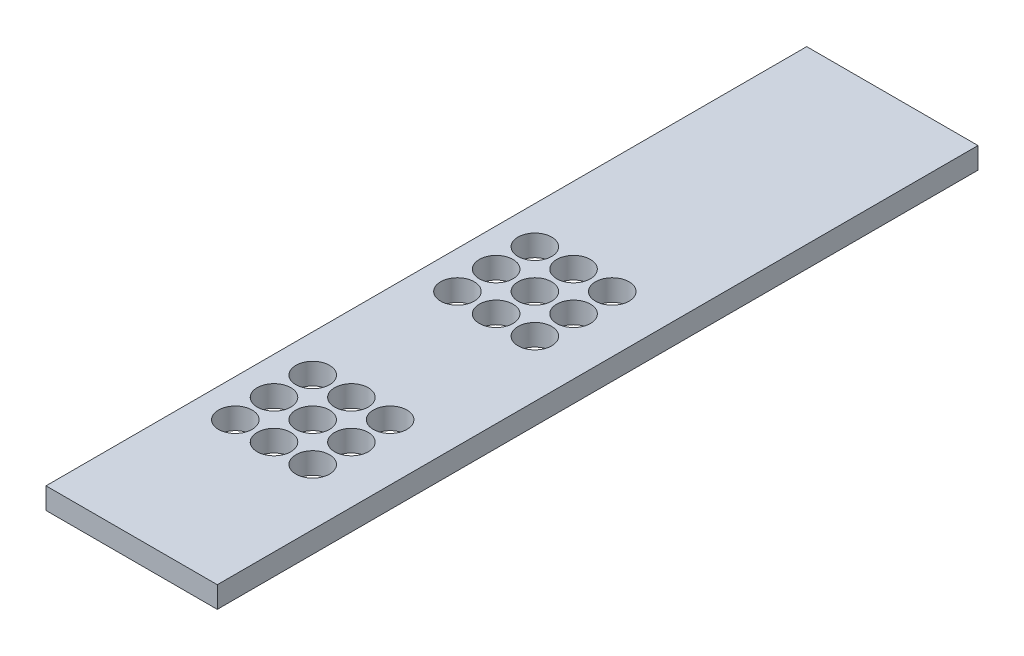
ISO-10303-21;
HEADER;
FILE_DESCRIPTION(('STEP AP214'),'2;1');
FILE_NAME('part.step','',(''),(''),'','','');
FILE_SCHEMA(('AUTOMOTIVE_DESIGN { 1 0 10303 214 1 1 1 1 }'));
ENDSEC;
DATA;
#1=APPLICATION_CONTEXT('core data for automotive mechanical design processes');
#2=APPLICATION_PROTOCOL_DEFINITION('international standard','automotive_design',2000,#1);
#3=PRODUCT_CONTEXT('',#1,'mechanical');
#4=PRODUCT('Part','Part','',(#3));
#5=PRODUCT_RELATED_PRODUCT_CATEGORY('part','',(#4));
#6=PRODUCT_DEFINITION_FORMATION('','',#4);
#7=PRODUCT_DEFINITION_CONTEXT('part definition',#1,'design');
#8=PRODUCT_DEFINITION('design','',#6,#7);
#9=PRODUCT_DEFINITION_SHAPE('','',#8);
#10=(LENGTH_UNIT() NAMED_UNIT(*) SI_UNIT(.MILLI.,.METRE.));
#11=(NAMED_UNIT(*) PLANE_ANGLE_UNIT() SI_UNIT($,.RADIAN.));
#12=(NAMED_UNIT(*) SI_UNIT($,.STERADIAN.) SOLID_ANGLE_UNIT());
#13=UNCERTAINTY_MEASURE_WITH_UNIT(LENGTH_MEASURE(1.E-05),#10,'distance_accuracy_value','');
#14=(GEOMETRIC_REPRESENTATION_CONTEXT(3) GLOBAL_UNCERTAINTY_ASSIGNED_CONTEXT((#13)) GLOBAL_UNIT_ASSIGNED_CONTEXT((#10,
#11,#12)) REPRESENTATION_CONTEXT('',''));
#15=CARTESIAN_POINT('',(0.,0.,0.));
#16=DIRECTION('',(0.,0.,1.));
#17=DIRECTION('',(1.,0.,0.));
#18=AXIS2_PLACEMENT_3D('',#15,#16,#17);
#19=CARTESIAN_POINT('',(-14.330550206,-3.17499999999984,157.875882711151));
#20=DIRECTION('',(0.,1.,0.));
#21=DIRECTION('',(0.,0.,1.));
#22=AXIS2_PLACEMENT_3D('',#19,#20,#21);
#23=CYLINDRICAL_SURFACE('',#22,5.00000003299999);
#24=CARTESIAN_POINT('',(-14.330550206,-3.17499999999984,157.875882711151));
#25=DIRECTION('',(0.,1.,0.));
#26=DIRECTION('',(0.,0.,1.));
#27=AXIS2_PLACEMENT_3D('',#24,#25,#26);
#28=CIRCLE('',#27,5.00000003299999);
#29=CARTESIAN_POINT('',(-14.330550206,-3.17499999999984,162.875882744151));
#30=VERTEX_POINT('',#29);
#31=EDGE_CURVE('E49',#30,#30,#28,.T.);
#32=ORIENTED_EDGE('',*,*,#31,.F.);
#33=EDGE_LOOP('',(#32));
#34=FACE_BOUND('',#33,.T.);
#35=CARTESIAN_POINT('',(-14.330550206,3.17500000000016,157.875882711151));
#36=DIRECTION('',(0.,1.,0.));
#37=DIRECTION('',(0.,0.,1.));
#38=AXIS2_PLACEMENT_3D('',#35,#36,#37);
#39=CIRCLE('',#38,5.00000003299999);
#40=CARTESIAN_POINT('',(-14.330550206,3.17500000000016,162.875882744151));
#41=VERTEX_POINT('',#40);
#42=EDGE_CURVE('E11',#41,#41,#39,.T.);
#43=ORIENTED_EDGE('',*,*,#42,.T.);
#44=EDGE_LOOP('',(#43));
#45=FACE_BOUND('',#44,.T.);
#46=ADVANCED_FACE('F41',(#34,#45),#23,.F.);
#47=CARTESIAN_POINT('',(-2.830550092,-3.17499999999992,157.875882711151));
#48=DIRECTION('',(0.,1.,0.));
#49=DIRECTION('',(0.,0.,1.));
#50=AXIS2_PLACEMENT_3D('',#47,#48,#49);
#51=CYLINDRICAL_SURFACE('',#50,5.00000003299999);
#52=CARTESIAN_POINT('',(-2.830550092,-3.17499999999992,157.875882711151));
#53=DIRECTION('',(0.,1.,0.));
#54=DIRECTION('',(0.,0.,1.));
#55=AXIS2_PLACEMENT_3D('',#52,#53,#54);
#56=CIRCLE('',#55,5.00000003299999);
#57=CARTESIAN_POINT('',(-2.830550092,-3.17499999999992,162.875882744151));
#58=VERTEX_POINT('',#57);
#59=EDGE_CURVE('E149',#58,#58,#56,.T.);
#60=ORIENTED_EDGE('',*,*,#59,.F.);
#61=EDGE_LOOP('',(#60));
#62=FACE_BOUND('',#61,.T.);
#63=CARTESIAN_POINT('',(-2.830550092,3.17500000000008,157.875882711151));
#64=DIRECTION('',(0.,1.,0.));
#65=DIRECTION('',(0.,0.,1.));
#66=AXIS2_PLACEMENT_3D('',#63,#64,#65);
#67=CIRCLE('',#66,5.00000003299999);
#68=CARTESIAN_POINT('',(-2.830550092,3.17500000000008,162.875882744151));
#69=VERTEX_POINT('',#68);
#70=EDGE_CURVE('E152',#69,#69,#67,.T.);
#71=ORIENTED_EDGE('',*,*,#70,.T.);
#72=EDGE_LOOP('',(#71));
#73=FACE_BOUND('',#72,.T.);
#74=ADVANCED_FACE('F161',(#62,#73),#51,.F.);
#75=CARTESIAN_POINT('',(8.669450022,-3.175,157.875882711151));
#76=DIRECTION('',(0.,1.,0.));
#77=DIRECTION('',(0.,0.,1.));
#78=AXIS2_PLACEMENT_3D('',#75,#76,#77);
#79=CYLINDRICAL_SURFACE('',#78,5.00000003299999);
#80=CARTESIAN_POINT('',(8.669450022,-3.175,157.875882711151));
#81=DIRECTION('',(0.,1.,0.));
#82=DIRECTION('',(0.,0.,1.));
#83=AXIS2_PLACEMENT_3D('',#80,#81,#82);
#84=CIRCLE('',#83,5.00000003299999);
#85=CARTESIAN_POINT('',(8.669450022,-3.175,162.875882744151));
#86=VERTEX_POINT('',#85);
#87=EDGE_CURVE('E143',#86,#86,#84,.T.);
#88=ORIENTED_EDGE('',*,*,#87,.F.);
#89=EDGE_LOOP('',(#88));
#90=FACE_BOUND('',#89,.T.);
#91=CARTESIAN_POINT('',(8.669450022,3.175,157.875882711151));
#92=DIRECTION('',(0.,1.,0.));
#93=DIRECTION('',(0.,0.,1.));
#94=AXIS2_PLACEMENT_3D('',#91,#92,#93);
#95=CIRCLE('',#94,5.00000003299999);
#96=CARTESIAN_POINT('',(8.669450022,3.175,162.875882744151));
#97=VERTEX_POINT('',#96);
#98=EDGE_CURVE('E146',#97,#97,#95,.T.);
#99=ORIENTED_EDGE('',*,*,#98,.T.);
#100=EDGE_LOOP('',(#99));
#101=FACE_BOUND('',#100,.T.);
#102=ADVANCED_FACE('F196',(#90,#101),#79,.F.);
#103=CARTESIAN_POINT('',(-14.330550206,-3.17499999999984,169.375882825151));
#104=DIRECTION('',(0.,1.,0.));
#105=DIRECTION('',(0.,0.,1.));
#106=AXIS2_PLACEMENT_3D('',#103,#104,#105);
#107=CYLINDRICAL_SURFACE('',#106,5.00000003299999);
#108=CARTESIAN_POINT('',(-14.330550206,-3.17499999999984,169.375882825151));
#109=DIRECTION('',(0.,1.,0.));
#110=DIRECTION('',(0.,0.,1.));
#111=AXIS2_PLACEMENT_3D('',#108,#109,#110);
#112=CIRCLE('',#111,5.00000003299999);
#113=CARTESIAN_POINT('',(-14.330550206,-3.17499999999984,174.375882858151));
#114=VERTEX_POINT('',#113);
#115=EDGE_CURVE('E137',#114,#114,#112,.T.);
#116=ORIENTED_EDGE('',*,*,#115,.F.);
#117=EDGE_LOOP('',(#116));
#118=FACE_BOUND('',#117,.T.);
#119=CARTESIAN_POINT('',(-14.330550206,3.17500000000016,169.375882825151));
#120=DIRECTION('',(0.,1.,0.));
#121=DIRECTION('',(0.,0.,1.));
#122=AXIS2_PLACEMENT_3D('',#119,#120,#121);
#123=CIRCLE('',#122,5.00000003299999);
#124=CARTESIAN_POINT('',(-14.330550206,3.17500000000016,174.375882858151));
#125=VERTEX_POINT('',#124);
#126=EDGE_CURVE('E140',#125,#125,#123,.T.);
#127=ORIENTED_EDGE('',*,*,#126,.T.);
#128=EDGE_LOOP('',(#127));
#129=FACE_BOUND('',#128,.T.);
#130=ADVANCED_FACE('F192',(#118,#129),#107,.F.);
#131=CARTESIAN_POINT('',(-2.830550092,-3.17499999999992,169.375882825151));
#132=DIRECTION('',(0.,1.,0.));
#133=DIRECTION('',(0.,0.,1.));
#134=AXIS2_PLACEMENT_3D('',#131,#132,#133);
#135=CYLINDRICAL_SURFACE('',#134,5.00000003299999);
#136=CARTESIAN_POINT('',(-2.830550092,-3.17499999999992,169.375882825151));
#137=DIRECTION('',(0.,1.,0.));
#138=DIRECTION('',(0.,0.,1.));
#139=AXIS2_PLACEMENT_3D('',#136,#137,#138);
#140=CIRCLE('',#139,5.00000003299999);
#141=CARTESIAN_POINT('',(-2.830550092,-3.17499999999992,174.375882858151));
#142=VERTEX_POINT('',#141);
#143=EDGE_CURVE('E131',#142,#142,#140,.T.);
#144=ORIENTED_EDGE('',*,*,#143,.F.);
#145=EDGE_LOOP('',(#144));
#146=FACE_BOUND('',#145,.T.);
#147=CARTESIAN_POINT('',(-2.830550092,3.17500000000008,169.375882825151));
#148=DIRECTION('',(0.,1.,0.));
#149=DIRECTION('',(0.,0.,1.));
#150=AXIS2_PLACEMENT_3D('',#147,#148,#149);
#151=CIRCLE('',#150,5.00000003299999);
#152=CARTESIAN_POINT('',(-2.830550092,3.17500000000008,174.375882858151));
#153=VERTEX_POINT('',#152);
#154=EDGE_CURVE('E134',#153,#153,#151,.T.);
#155=ORIENTED_EDGE('',*,*,#154,.T.);
#156=EDGE_LOOP('',(#155));
#157=FACE_BOUND('',#156,.T.);
#158=ADVANCED_FACE('F188',(#146,#157),#135,.F.);
#159=CARTESIAN_POINT('',(8.669450022,-3.175,169.375882825151));
#160=DIRECTION('',(0.,1.,0.));
#161=DIRECTION('',(0.,0.,1.));
#162=AXIS2_PLACEMENT_3D('',#159,#160,#161);
#163=CYLINDRICAL_SURFACE('',#162,5.00000003299999);
#164=CARTESIAN_POINT('',(8.669450022,-3.175,169.375882825151));
#165=DIRECTION('',(0.,1.,0.));
#166=DIRECTION('',(0.,0.,1.));
#167=AXIS2_PLACEMENT_3D('',#164,#165,#166);
#168=CIRCLE('',#167,5.00000003299999);
#169=CARTESIAN_POINT('',(8.669450022,-3.175,174.375882858151));
#170=VERTEX_POINT('',#169);
#171=EDGE_CURVE('E125',#170,#170,#168,.T.);
#172=ORIENTED_EDGE('',*,*,#171,.F.);
#173=EDGE_LOOP('',(#172));
#174=FACE_BOUND('',#173,.T.);
#175=CARTESIAN_POINT('',(8.669450022,3.175,169.375882825151));
#176=DIRECTION('',(0.,1.,0.));
#177=DIRECTION('',(0.,0.,1.));
#178=AXIS2_PLACEMENT_3D('',#175,#176,#177);
#179=CIRCLE('',#178,5.00000003299999);
#180=CARTESIAN_POINT('',(8.669450022,3.175,174.375882858151));
#181=VERTEX_POINT('',#180);
#182=EDGE_CURVE('E128',#181,#181,#179,.T.);
#183=ORIENTED_EDGE('',*,*,#182,.T.);
#184=EDGE_LOOP('',(#183));
#185=FACE_BOUND('',#184,.T.);
#186=ADVANCED_FACE('F184',(#174,#185),#163,.F.);
#187=CARTESIAN_POINT('',(-14.330550206,-3.17499999999984,180.875882939151));
#188=DIRECTION('',(0.,1.,0.));
#189=DIRECTION('',(0.,0.,1.));
#190=AXIS2_PLACEMENT_3D('',#187,#188,#189);
#191=CYLINDRICAL_SURFACE('',#190,5.00000003299999);
#192=CARTESIAN_POINT('',(-14.330550206,-3.17499999999984,180.875882939151));
#193=DIRECTION('',(0.,1.,0.));
#194=DIRECTION('',(0.,0.,1.));
#195=AXIS2_PLACEMENT_3D('',#192,#193,#194);
#196=CIRCLE('',#195,5.00000003299999);
#197=CARTESIAN_POINT('',(-14.330550206,-3.17499999999984,185.875882972151));
#198=VERTEX_POINT('',#197);
#199=EDGE_CURVE('E119',#198,#198,#196,.T.);
#200=ORIENTED_EDGE('',*,*,#199,.F.);
#201=EDGE_LOOP('',(#200));
#202=FACE_BOUND('',#201,.T.);
#203=CARTESIAN_POINT('',(-14.330550206,3.17500000000016,180.875882939151));
#204=DIRECTION('',(0.,1.,0.));
#205=DIRECTION('',(0.,0.,1.));
#206=AXIS2_PLACEMENT_3D('',#203,#204,#205);
#207=CIRCLE('',#206,5.00000003299999);
#208=CARTESIAN_POINT('',(-14.330550206,3.17500000000016,185.875882972151));
#209=VERTEX_POINT('',#208);
#210=EDGE_CURVE('E122',#209,#209,#207,.T.);
#211=ORIENTED_EDGE('',*,*,#210,.T.);
#212=EDGE_LOOP('',(#211));
#213=FACE_BOUND('',#212,.T.);
#214=ADVANCED_FACE('F175',(#202,#213),#191,.F.);
#215=CARTESIAN_POINT('',(25.44445,-3.175,225.99904));
#216=DIRECTION('',(-1.,0.,0.));
#217=DIRECTION('',(0.,0.,1.));
#218=AXIS2_PLACEMENT_3D('',#215,#216,#217);
#219=PLANE('',#218);
#220=DIRECTION('',(0.,1.,0.));
#221=VECTOR('',#220,1.);
#222=CARTESIAN_POINT('',(25.44445,-3.175,0.));
#223=LINE('',#222,#221);
#224=CARTESIAN_POINT('',(25.44445,-3.175,0.));
#225=VERTEX_POINT('',#224);
#226=CARTESIAN_POINT('',(25.44445,3.175,0.));
#227=VERTEX_POINT('',#226);
#228=EDGE_CURVE('E109',#225,#227,#223,.T.);
#229=ORIENTED_EDGE('',*,*,#228,.T.);
#230=DIRECTION('',(0.,0.,-1.));
#231=VECTOR('',#230,1.);
#232=CARTESIAN_POINT('',(25.44445,3.175,225.99904));
#233=LINE('',#232,#231);
#234=CARTESIAN_POINT('',(25.44445,3.175,225.99904));
#235=VERTEX_POINT('',#234);
#236=EDGE_CURVE('E100',#235,#227,#233,.T.);
#237=ORIENTED_EDGE('',*,*,#236,.F.);
#238=DIRECTION('',(0.,1.,0.));
#239=VECTOR('',#238,1.);
#240=CARTESIAN_POINT('',(25.44445,-3.175,225.99904));
#241=LINE('',#240,#239);
#242=CARTESIAN_POINT('',(25.44445,-3.175,225.99904));
#243=VERTEX_POINT('',#242);
#244=EDGE_CURVE('E93',#243,#235,#241,.T.);
#245=ORIENTED_EDGE('',*,*,#244,.F.);
#246=DIRECTION('',(0.,0.,-1.));
#247=VECTOR('',#246,1.);
#248=CARTESIAN_POINT('',(25.44445,-3.175,225.99904));
#249=LINE('',#248,#247);
#250=EDGE_CURVE('E105',#243,#225,#249,.T.);
#251=ORIENTED_EDGE('',*,*,#250,.T.);
#252=EDGE_LOOP('',(#229,#237,#245,#251));
#253=FACE_BOUND('',#252,.T.);
#254=ADVANCED_FACE('F165',(#253),#219,.F.);
#255=CARTESIAN_POINT('',(-25.44445,3.175,225.99904));
#256=DIRECTION('',(0.,-1.,0.));
#257=DIRECTION('',(0.,0.,-1.));
#258=AXIS2_PLACEMENT_3D('',#255,#256,#257);
#259=PLANE('',#258);
#260=CARTESIAN_POINT('',(8.669450022,3.175,103.375882745151));
#261=DIRECTION('',(0.,1.,0.));
#262=DIRECTION('',(0.,0.,1.));
#263=AXIS2_PLACEMENT_3D('',#260,#261,#262);
#264=CIRCLE('',#263,5.00000003299999);
#265=CARTESIAN_POINT('',(8.669450022,3.175,108.375882778151));
#266=VERTEX_POINT('',#265);
#267=EDGE_CURVE('E298',#266,#266,#264,.T.);
#268=ORIENTED_EDGE('',*,*,#267,.F.);
#269=EDGE_LOOP('',(#268));
#270=FACE_BOUND('',#269,.T.);
#271=CARTESIAN_POINT('',(8.669450022,3.175,91.8758826311515));
#272=DIRECTION('',(0.,1.,0.));
#273=DIRECTION('',(0.,0.,1.));
#274=AXIS2_PLACEMENT_3D('',#271,#272,#273);
#275=CIRCLE('',#274,5.00000003299999);
#276=CARTESIAN_POINT('',(8.669450022,3.175,96.8758826641515));
#277=VERTEX_POINT('',#276);
#278=EDGE_CURVE('E304',#277,#277,#275,.T.);
#279=ORIENTED_EDGE('',*,*,#278,.F.);
#280=EDGE_LOOP('',(#279));
#281=FACE_BOUND('',#280,.T.);
#282=CARTESIAN_POINT('',(-2.830550092,3.17500000000008,114.875882859151));
#283=DIRECTION('',(0.,1.,0.));
#284=DIRECTION('',(0.,0.,1.));
#285=AXIS2_PLACEMENT_3D('',#282,#283,#284);
#286=CIRCLE('',#285,5.00000003299999);
#287=CARTESIAN_POINT('',(-2.830550092,3.17500000000008,119.875882892151));
#288=VERTEX_POINT('',#287);
#289=EDGE_CURVE('E310',#288,#288,#286,.T.);
#290=ORIENTED_EDGE('',*,*,#289,.F.);
#291=EDGE_LOOP('',(#290));
#292=FACE_BOUND('',#291,.T.);
#293=CARTESIAN_POINT('',(-2.830550092,3.17500000000008,103.375882745151));
#294=DIRECTION('',(0.,1.,0.));
#295=DIRECTION('',(0.,0.,1.));
#296=AXIS2_PLACEMENT_3D('',#293,#294,#295);
#297=CIRCLE('',#296,5.00000003299999);
#298=CARTESIAN_POINT('',(-2.830550092,3.17500000000008,108.375882778151));
#299=VERTEX_POINT('',#298);
#300=EDGE_CURVE('E286',#299,#299,#297,.T.);
#301=ORIENTED_EDGE('',*,*,#300,.F.);
#302=EDGE_LOOP('',(#301));
#303=FACE_BOUND('',#302,.T.);
#304=CARTESIAN_POINT('',(-14.330550206,3.17500000000016,91.8758826311515));
#305=DIRECTION('',(0.,1.,0.));
#306=DIRECTION('',(0.,0.,1.));
#307=AXIS2_PLACEMENT_3D('',#304,#305,#306);
#308=CIRCLE('',#307,5.00000003299999);
#309=CARTESIAN_POINT('',(-14.330550206,3.17500000000016,96.8758826641515));
#310=VERTEX_POINT('',#309);
#311=EDGE_CURVE('E278',#310,#310,#308,.T.);
#312=ORIENTED_EDGE('',*,*,#311,.F.);
#313=EDGE_LOOP('',(#312));
#314=FACE_BOUND('',#313,.T.);
#315=CARTESIAN_POINT('',(-14.330550206,3.17500000000016,103.375882745151));
#316=DIRECTION('',(0.,1.,0.));
#317=DIRECTION('',(0.,0.,1.));
#318=AXIS2_PLACEMENT_3D('',#315,#316,#317);
#319=CIRCLE('',#318,5.00000003299999);
#320=CARTESIAN_POINT('',(-14.330550206,3.17500000000016,108.375882778151));
#321=VERTEX_POINT('',#320);
#322=EDGE_CURVE('E271',#321,#321,#319,.T.);
#323=ORIENTED_EDGE('',*,*,#322,.F.);
#324=EDGE_LOOP('',(#323));
#325=FACE_BOUND('',#324,.T.);
#326=CARTESIAN_POINT('',(-14.330550206,3.17500000000016,114.875882859151));
#327=DIRECTION('',(0.,1.,0.));
#328=DIRECTION('',(0.,0.,1.));
#329=AXIS2_PLACEMENT_3D('',#326,#327,#328);
#330=CIRCLE('',#329,5.00000003299999);
#331=CARTESIAN_POINT('',(-14.330550206,3.17500000000016,119.875882892151));
#332=VERTEX_POINT('',#331);
#333=EDGE_CURVE('E275',#332,#332,#330,.T.);
#334=ORIENTED_EDGE('',*,*,#333,.F.);
#335=EDGE_LOOP('',(#334));
#336=FACE_BOUND('',#335,.T.);
#337=CARTESIAN_POINT('',(-2.830550092,3.17500000000008,91.8758826311515));
#338=DIRECTION('',(0.,1.,0.));
#339=DIRECTION('',(0.,0.,1.));
#340=AXIS2_PLACEMENT_3D('',#337,#338,#339);
#341=CIRCLE('',#340,5.00000003299999);
#342=CARTESIAN_POINT('',(-2.830550092,3.17500000000008,96.8758826641515));
#343=VERTEX_POINT('',#342);
#344=EDGE_CURVE('E287',#343,#343,#341,.T.);
#345=ORIENTED_EDGE('',*,*,#344,.F.);
#346=EDGE_LOOP('',(#345));
#347=FACE_BOUND('',#346,.T.);
#348=CARTESIAN_POINT('',(8.669450022,3.175,114.875882859151));
#349=DIRECTION('',(0.,1.,0.));
#350=DIRECTION('',(0.,0.,1.));
#351=AXIS2_PLACEMENT_3D('',#348,#349,#350);
#352=CIRCLE('',#351,5.00000003299999);
#353=CARTESIAN_POINT('',(8.669450022,3.175,119.875882892151));
#354=VERTEX_POINT('',#353);
#355=EDGE_CURVE('E297',#354,#354,#352,.T.);
#356=ORIENTED_EDGE('',*,*,#355,.F.);
#357=EDGE_LOOP('',(#356));
#358=FACE_BOUND('',#357,.T.);
#359=CARTESIAN_POINT('',(-2.830550092,3.17500000000008,180.875882939151));
#360=DIRECTION('',(0.,1.,0.));
#361=DIRECTION('',(0.,0.,1.));
#362=AXIS2_PLACEMENT_3D('',#359,#360,#361);
#363=CIRCLE('',#362,5.00000003299999);
#364=CARTESIAN_POINT('',(-2.830550092,3.17500000000008,185.875882972151));
#365=VERTEX_POINT('',#364);
#366=EDGE_CURVE('E326',#365,#365,#363,.T.);
#367=ORIENTED_EDGE('',*,*,#366,.F.);
#368=EDGE_LOOP('',(#367));
#369=FACE_BOUND('',#368,.T.);
#370=CARTESIAN_POINT('',(8.669450022,3.175,180.875882939151));
#371=DIRECTION('',(0.,1.,0.));
#372=DIRECTION('',(0.,0.,1.));
#373=AXIS2_PLACEMENT_3D('',#370,#371,#372);
#374=CIRCLE('',#373,5.00000003299999);
#375=CARTESIAN_POINT('',(8.669450022,3.175,185.875882972151));
#376=VERTEX_POINT('',#375);
#377=EDGE_CURVE('E329',#376,#376,#374,.T.);
#378=ORIENTED_EDGE('',*,*,#377,.F.);
#379=EDGE_LOOP('',(#378));
#380=FACE_BOUND('',#379,.T.);
#381=DIRECTION('',(-1.,0.,0.));
#382=VECTOR('',#381,1.);
#383=CARTESIAN_POINT('',(-25.44445,3.175,0.));
#384=LINE('',#383,#382);
#385=CARTESIAN_POINT('',(-25.44445,3.175,0.));
#386=VERTEX_POINT('',#385);
#387=EDGE_CURVE('E99',#227,#386,#384,.T.);
#388=ORIENTED_EDGE('',*,*,#387,.T.);
#389=DIRECTION('',(0.,0.,-1.));
#390=VECTOR('',#389,1.);
#391=CARTESIAN_POINT('',(-25.44445,3.175,225.99904));
#392=LINE('',#391,#390);
#393=CARTESIAN_POINT('',(-25.44445,3.175,225.99904));
#394=VERTEX_POINT('',#393);
#395=EDGE_CURVE('E96',#394,#386,#392,.T.);
#396=ORIENTED_EDGE('',*,*,#395,.F.);
#397=DIRECTION('',(-1.,0.,0.));
#398=VECTOR('',#397,1.);
#399=CARTESIAN_POINT('',(-25.44445,3.175,225.99904));
#400=LINE('',#399,#398);
#401=EDGE_CURVE('E88',#235,#394,#400,.T.);
#402=ORIENTED_EDGE('',*,*,#401,.F.);
#403=ORIENTED_EDGE('',*,*,#236,.T.);
#404=EDGE_LOOP('',(#388,#396,#402,#403));
#405=FACE_BOUND('',#404,.T.);
#406=ORIENTED_EDGE('',*,*,#210,.F.);
#407=EDGE_LOOP('',(#406));
#408=FACE_BOUND('',#407,.T.);
#409=ORIENTED_EDGE('',*,*,#182,.F.);
#410=EDGE_LOOP('',(#409));
#411=FACE_BOUND('',#410,.T.);
#412=ORIENTED_EDGE('',*,*,#154,.F.);
#413=EDGE_LOOP('',(#412));
#414=FACE_BOUND('',#413,.T.);
#415=ORIENTED_EDGE('',*,*,#126,.F.);
#416=EDGE_LOOP('',(#415));
#417=FACE_BOUND('',#416,.T.);
#418=ORIENTED_EDGE('',*,*,#98,.F.);
#419=EDGE_LOOP('',(#418));
#420=FACE_BOUND('',#419,.T.);
#421=ORIENTED_EDGE('',*,*,#70,.F.);
#422=EDGE_LOOP('',(#421));
#423=FACE_BOUND('',#422,.T.);
#424=ORIENTED_EDGE('',*,*,#42,.F.);
#425=EDGE_LOOP('',(#424));
#426=FACE_BOUND('',#425,.T.);
#427=ADVANCED_FACE('F97',(#270,#281,#292,#303,#314,#325,#336,#347,#358,#369,#380,#405,#408,#411,
#414,#417,#420,#423,#426),#259,.F.);
#428=CARTESIAN_POINT('',(-25.44445,-3.175,225.99904));
#429=DIRECTION('',(1.,0.,0.));
#430=DIRECTION('',(0.,0.,-1.));
#431=AXIS2_PLACEMENT_3D('',#428,#429,#430);
#432=PLANE('',#431);
#433=DIRECTION('',(0.,-1.,0.));
#434=VECTOR('',#433,1.);
#435=CARTESIAN_POINT('',(-25.44445,-3.175,0.));
#436=LINE('',#435,#434);
#437=CARTESIAN_POINT('',(-25.44445,-3.175,0.));
#438=VERTEX_POINT('',#437);
#439=EDGE_CURVE('E74',#386,#438,#436,.T.);
#440=ORIENTED_EDGE('',*,*,#439,.T.);
#441=DIRECTION('',(0.,0.,-1.));
#442=VECTOR('',#441,1.);
#443=CARTESIAN_POINT('',(-25.44445,-3.175,225.99904));
#444=LINE('',#443,#442);
#445=CARTESIAN_POINT('',(-25.44445,-3.175,225.99904));
#446=VERTEX_POINT('',#445);
#447=EDGE_CURVE('E101',#446,#438,#444,.T.);
#448=ORIENTED_EDGE('',*,*,#447,.F.);
#449=DIRECTION('',(0.,-1.,0.));
#450=VECTOR('',#449,1.);
#451=CARTESIAN_POINT('',(-25.44445,-3.175,225.99904));
#452=LINE('',#451,#450);
#453=EDGE_CURVE('E91',#394,#446,#452,.T.);
#454=ORIENTED_EDGE('',*,*,#453,.F.);
#455=ORIENTED_EDGE('',*,*,#395,.T.);
#456=EDGE_LOOP('',(#440,#448,#454,#455));
#457=FACE_BOUND('',#456,.T.);
#458=ADVANCED_FACE('F103',(#457),#432,.F.);
#459=CARTESIAN_POINT('',(-25.44445,-3.175,225.99904));
#460=DIRECTION('',(0.,1.,0.));
#461=DIRECTION('',(0.,0.,1.));
#462=AXIS2_PLACEMENT_3D('',#459,#460,#461);
#463=PLANE('',#462);
#464=CARTESIAN_POINT('',(8.669450022,-3.175,103.375882745151));
#465=DIRECTION('',(0.,1.,0.));
#466=DIRECTION('',(0.,0.,1.));
#467=AXIS2_PLACEMENT_3D('',#464,#465,#466);
#468=CIRCLE('',#467,5.00000003299999);
#469=CARTESIAN_POINT('',(8.669450022,-3.175,108.375882778151));
#470=VERTEX_POINT('',#469);
#471=EDGE_CURVE('E295',#470,#470,#468,.T.);
#472=ORIENTED_EDGE('',*,*,#471,.T.);
#473=EDGE_LOOP('',(#472));
#474=FACE_BOUND('',#473,.T.);
#475=CARTESIAN_POINT('',(8.669450022,-3.175,91.8758826311515));
#476=DIRECTION('',(0.,1.,0.));
#477=DIRECTION('',(0.,0.,1.));
#478=AXIS2_PLACEMENT_3D('',#475,#476,#477);
#479=CIRCLE('',#478,5.00000003299999);
#480=CARTESIAN_POINT('',(8.669450022,-3.175,96.8758826641515));
#481=VERTEX_POINT('',#480);
#482=EDGE_CURVE('E301',#481,#481,#479,.T.);
#483=ORIENTED_EDGE('',*,*,#482,.T.);
#484=EDGE_LOOP('',(#483));
#485=FACE_BOUND('',#484,.T.);
#486=CARTESIAN_POINT('',(-2.830550092,-3.175,114.875882859151));
#487=DIRECTION('',(0.,1.,0.));
#488=DIRECTION('',(0.,0.,1.));
#489=AXIS2_PLACEMENT_3D('',#486,#487,#488);
#490=CIRCLE('',#489,5.00000003299999);
#491=CARTESIAN_POINT('',(-2.830550092,-3.175,119.875882892151));
#492=VERTEX_POINT('',#491);
#493=EDGE_CURVE('E307',#492,#492,#490,.T.);
#494=ORIENTED_EDGE('',*,*,#493,.T.);
#495=EDGE_LOOP('',(#494));
#496=FACE_BOUND('',#495,.T.);
#497=CARTESIAN_POINT('',(-2.830550092,-3.175,103.375882745151));
#498=DIRECTION('',(0.,1.,0.));
#499=DIRECTION('',(0.,0.,1.));
#500=AXIS2_PLACEMENT_3D('',#497,#498,#499);
#501=CIRCLE('',#500,5.00000003299999);
#502=CARTESIAN_POINT('',(-2.830550092,-3.175,108.375882778151));
#503=VERTEX_POINT('',#502);
#504=EDGE_CURVE('E313',#503,#503,#501,.T.);
#505=ORIENTED_EDGE('',*,*,#504,.T.);
#506=EDGE_LOOP('',(#505));
#507=FACE_BOUND('',#506,.T.);
#508=CARTESIAN_POINT('',(-14.330550206,-3.175,91.8758826311515));
#509=DIRECTION('',(0.,1.,0.));
#510=DIRECTION('',(0.,0.,1.));
#511=AXIS2_PLACEMENT_3D('',#508,#509,#510);
#512=CIRCLE('',#511,5.00000003299999);
#513=CARTESIAN_POINT('',(-14.330550206,-3.175,96.8758826641515));
#514=VERTEX_POINT('',#513);
#515=EDGE_CURVE('E273',#514,#514,#512,.T.);
#516=ORIENTED_EDGE('',*,*,#515,.T.);
#517=EDGE_LOOP('',(#516));
#518=FACE_BOUND('',#517,.T.);
#519=CARTESIAN_POINT('',(-14.330550206,-3.175,103.375882745151));
#520=DIRECTION('',(0.,1.,0.));
#521=DIRECTION('',(0.,0.,1.));
#522=AXIS2_PLACEMENT_3D('',#519,#520,#521);
#523=CIRCLE('',#522,5.00000003299999);
#524=CARTESIAN_POINT('',(-14.330550206,-3.175,108.375882778151));
#525=VERTEX_POINT('',#524);
#526=EDGE_CURVE('E268',#525,#525,#523,.T.);
#527=ORIENTED_EDGE('',*,*,#526,.T.);
#528=EDGE_LOOP('',(#527));
#529=FACE_BOUND('',#528,.T.);
#530=CARTESIAN_POINT('',(-14.330550206,-3.175,114.875882859151));
#531=DIRECTION('',(0.,1.,0.));
#532=DIRECTION('',(0.,0.,1.));
#533=AXIS2_PLACEMENT_3D('',#530,#531,#532);
#534=CIRCLE('',#533,5.00000003299999);
#535=CARTESIAN_POINT('',(-14.330550206,-3.175,119.875882892151));
#536=VERTEX_POINT('',#535);
#537=EDGE_CURVE('E290',#536,#536,#534,.T.);
#538=ORIENTED_EDGE('',*,*,#537,.T.);
#539=EDGE_LOOP('',(#538));
#540=FACE_BOUND('',#539,.T.);
#541=CARTESIAN_POINT('',(-2.830550092,-3.175,91.8758826311515));
#542=DIRECTION('',(0.,1.,0.));
#543=DIRECTION('',(0.,0.,1.));
#544=AXIS2_PLACEMENT_3D('',#541,#542,#543);
#545=CIRCLE('',#544,5.00000003299999);
#546=CARTESIAN_POINT('',(-2.830550092,-3.175,96.8758826641515));
#547=VERTEX_POINT('',#546);
#548=EDGE_CURVE('E283',#547,#547,#545,.T.);
#549=ORIENTED_EDGE('',*,*,#548,.T.);
#550=EDGE_LOOP('',(#549));
#551=FACE_BOUND('',#550,.T.);
#552=CARTESIAN_POINT('',(8.669450022,-3.175,114.875882859151));
#553=DIRECTION('',(0.,1.,0.));
#554=DIRECTION('',(0.,0.,1.));
#555=AXIS2_PLACEMENT_3D('',#552,#553,#554);
#556=CIRCLE('',#555,5.00000003299999);
#557=CARTESIAN_POINT('',(8.669450022,-3.175,119.875882892151));
#558=VERTEX_POINT('',#557);
#559=EDGE_CURVE('E318',#558,#558,#556,.T.);
#560=ORIENTED_EDGE('',*,*,#559,.T.);
#561=EDGE_LOOP('',(#560));
#562=FACE_BOUND('',#561,.T.);
#563=CARTESIAN_POINT('',(-2.830550092,-3.17499999999992,180.875882939151));
#564=DIRECTION('',(0.,1.,0.));
#565=DIRECTION('',(0.,0.,1.));
#566=AXIS2_PLACEMENT_3D('',#563,#564,#565);
#567=CIRCLE('',#566,5.00000003299999);
#568=CARTESIAN_POINT('',(-2.830550092,-3.17499999999992,185.875882972151));
#569=VERTEX_POINT('',#568);
#570=EDGE_CURVE('E321',#569,#569,#567,.T.);
#571=ORIENTED_EDGE('',*,*,#570,.T.);
#572=EDGE_LOOP('',(#571));
#573=FACE_BOUND('',#572,.T.);
#574=CARTESIAN_POINT('',(8.669450022,-3.175,180.875882939151));
#575=DIRECTION('',(0.,1.,0.));
#576=DIRECTION('',(0.,0.,1.));
#577=AXIS2_PLACEMENT_3D('',#574,#575,#576);
#578=CIRCLE('',#577,5.00000003299999);
#579=CARTESIAN_POINT('',(8.669450022,-3.175,185.875882972151));
#580=VERTEX_POINT('',#579);
#581=EDGE_CURVE('E112',#580,#580,#578,.T.);
#582=ORIENTED_EDGE('',*,*,#581,.T.);
#583=EDGE_LOOP('',(#582));
#584=FACE_BOUND('',#583,.T.);
#585=DIRECTION('',(1.,0.,0.));
#586=VECTOR('',#585,1.);
#587=CARTESIAN_POINT('',(-25.44445,-3.175,0.));
#588=LINE('',#587,#586);
#589=EDGE_CURVE('E80',#438,#225,#588,.T.);
#590=ORIENTED_EDGE('',*,*,#589,.T.);
#591=ORIENTED_EDGE('',*,*,#250,.F.);
#592=DIRECTION('',(1.,0.,0.));
#593=VECTOR('',#592,1.);
#594=CARTESIAN_POINT('',(-25.44445,-3.175,225.99904));
#595=LINE('',#594,#593);
#596=EDGE_CURVE('E57',#446,#243,#595,.T.);
#597=ORIENTED_EDGE('',*,*,#596,.F.);
#598=ORIENTED_EDGE('',*,*,#447,.T.);
#599=EDGE_LOOP('',(#590,#591,#597,#598));
#600=FACE_BOUND('',#599,.T.);
#601=ORIENTED_EDGE('',*,*,#199,.T.);
#602=EDGE_LOOP('',(#601));
#603=FACE_BOUND('',#602,.T.);
#604=ORIENTED_EDGE('',*,*,#171,.T.);
#605=EDGE_LOOP('',(#604));
#606=FACE_BOUND('',#605,.T.);
#607=ORIENTED_EDGE('',*,*,#143,.T.);
#608=EDGE_LOOP('',(#607));
#609=FACE_BOUND('',#608,.T.);
#610=ORIENTED_EDGE('',*,*,#115,.T.);
#611=EDGE_LOOP('',(#610));
#612=FACE_BOUND('',#611,.T.);
#613=ORIENTED_EDGE('',*,*,#87,.T.);
#614=EDGE_LOOP('',(#613));
#615=FACE_BOUND('',#614,.T.);
#616=ORIENTED_EDGE('',*,*,#59,.T.);
#617=EDGE_LOOP('',(#616));
#618=FACE_BOUND('',#617,.T.);
#619=ORIENTED_EDGE('',*,*,#31,.T.);
#620=EDGE_LOOP('',(#619));
#621=FACE_BOUND('',#620,.T.);
#622=ADVANCED_FACE('F157',(#474,#485,#496,#507,#518,#529,#540,#551,#562,#573,#584,#600,#603,
#606,#609,#612,#615,#618,#621),#463,.F.);
#623=CARTESIAN_POINT('',(0.,0.,225.99904));
#624=DIRECTION('',(0.,0.,-1.));
#625=DIRECTION('',(-1.,0.,0.));
#626=AXIS2_PLACEMENT_3D('',#623,#624,#625);
#627=PLANE('',#626);
#628=ORIENTED_EDGE('',*,*,#244,.T.);
#629=ORIENTED_EDGE('',*,*,#401,.T.);
#630=ORIENTED_EDGE('',*,*,#453,.T.);
#631=ORIENTED_EDGE('',*,*,#596,.T.);
#632=EDGE_LOOP('',(#628,#629,#630,#631));
#633=FACE_BOUND('',#632,.T.);
#634=ADVANCED_FACE('F89',(#633),#627,.F.);
#635=CARTESIAN_POINT('',(0.,0.,0.));
#636=DIRECTION('',(0.,0.,-1.));
#637=DIRECTION('',(-1.,0.,0.));
#638=AXIS2_PLACEMENT_3D('',#635,#636,#637);
#639=PLANE('',#638);
#640=ORIENTED_EDGE('',*,*,#228,.F.);
#641=ORIENTED_EDGE('',*,*,#589,.F.);
#642=ORIENTED_EDGE('',*,*,#439,.F.);
#643=ORIENTED_EDGE('',*,*,#387,.F.);
#644=EDGE_LOOP('',(#640,#641,#642,#643));
#645=FACE_BOUND('',#644,.T.);
#646=ADVANCED_FACE('F214',(#645),#639,.T.);
#647=CARTESIAN_POINT('',(8.669450022,-3.175,180.875882939151));
#648=DIRECTION('',(0.,1.,0.));
#649=DIRECTION('',(0.,0.,1.));
#650=AXIS2_PLACEMENT_3D('',#647,#648,#649);
#651=CYLINDRICAL_SURFACE('',#650,5.00000003299999);
#652=ORIENTED_EDGE('',*,*,#581,.F.);
#653=EDGE_LOOP('',(#652));
#654=FACE_BOUND('',#653,.T.);
#655=ORIENTED_EDGE('',*,*,#377,.T.);
#656=EDGE_LOOP('',(#655));
#657=FACE_BOUND('',#656,.T.);
#658=ADVANCED_FACE('F220',(#654,#657),#651,.F.);
#659=CARTESIAN_POINT('',(-2.830550092,-3.17499999999992,180.875882939151));
#660=DIRECTION('',(0.,1.,0.));
#661=DIRECTION('',(0.,0.,1.));
#662=AXIS2_PLACEMENT_3D('',#659,#660,#661);
#663=CYLINDRICAL_SURFACE('',#662,5.00000003299999);
#664=ORIENTED_EDGE('',*,*,#570,.F.);
#665=EDGE_LOOP('',(#664));
#666=FACE_BOUND('',#665,.T.);
#667=ORIENTED_EDGE('',*,*,#366,.T.);
#668=EDGE_LOOP('',(#667));
#669=FACE_BOUND('',#668,.T.);
#670=ADVANCED_FACE('F225',(#666,#669),#663,.F.);
#671=CARTESIAN_POINT('',(8.669450022,-3.175,114.875882859151));
#672=DIRECTION('',(0.,1.,0.));
#673=DIRECTION('',(0.,0.,1.));
#674=AXIS2_PLACEMENT_3D('',#671,#672,#673);
#675=CYLINDRICAL_SURFACE('',#674,5.00000003299999);
#676=ORIENTED_EDGE('',*,*,#559,.F.);
#677=EDGE_LOOP('',(#676));
#678=FACE_BOUND('',#677,.T.);
#679=ORIENTED_EDGE('',*,*,#355,.T.);
#680=EDGE_LOOP('',(#679));
#681=FACE_BOUND('',#680,.T.);
#682=ADVANCED_FACE('F228',(#678,#681),#675,.F.);
#683=CARTESIAN_POINT('',(-2.830550092,-3.175,91.8758826311515));
#684=DIRECTION('',(0.,1.,0.));
#685=DIRECTION('',(0.,0.,1.));
#686=AXIS2_PLACEMENT_3D('',#683,#684,#685);
#687=CYLINDRICAL_SURFACE('',#686,5.00000003299999);
#688=CARTESIAN_POINT('',(-2.830550092,-3.175,96.8758826641515));
#689=CARTESIAN_POINT('',(-2.830550092,-3.10885416666667,96.8758826641515));
#690=CARTESIAN_POINT('',(-2.830550092,-3.04270833333333,96.8758826641515));
#691=CARTESIAN_POINT('',(-2.830550092,-2.91041666666666,96.8758826641515));
#692=CARTESIAN_POINT('',(-2.830550092,-2.84427083333333,96.8758826641515));
#693=CARTESIAN_POINT('',(-2.830550092,-2.71197916666666,96.8758826641515));
#694=CARTESIAN_POINT('',(-2.830550092,-2.64583333333333,96.8758826641515));
#695=CARTESIAN_POINT('',(-2.830550092,-2.51354166666666,96.8758826641515));
#696=CARTESIAN_POINT('',(-2.830550092,-2.44739583333332,96.8758826641515));
#697=CARTESIAN_POINT('',(-2.830550092,-2.31510416666666,96.8758826641515));
#698=CARTESIAN_POINT('',(-2.830550092,-2.24895833333332,96.8758826641515));
#699=CARTESIAN_POINT('',(-2.830550092,-2.11666666666665,96.8758826641515));
#700=CARTESIAN_POINT('',(-2.830550092,-2.05052083333332,96.8758826641515));
#701=CARTESIAN_POINT('',(-2.830550092,-1.91822916666665,96.8758826641515));
#702=CARTESIAN_POINT('',(-2.830550092,-1.85208333333332,96.8758826641515));
#703=CARTESIAN_POINT('',(-2.830550092,-1.71979166666665,96.8758826641515));
#704=CARTESIAN_POINT('',(-2.830550092,-1.65364583333331,96.8758826641515));
#705=CARTESIAN_POINT('',(-2.830550092,-1.52135416666665,96.8758826641515));
#706=CARTESIAN_POINT('',(-2.830550092,-1.45520833333331,96.8758826641515));
#707=CARTESIAN_POINT('',(-2.830550092,-1.32291666666664,96.8758826641515));
#708=CARTESIAN_POINT('',(-2.830550092,-1.25677083333331,96.8758826641515));
#709=CARTESIAN_POINT('',(-2.830550092,-1.12447916666664,96.8758826641515));
#710=CARTESIAN_POINT('',(-2.830550092,-1.05833333333331,96.8758826641515));
#711=CARTESIAN_POINT('',(-2.830550092,-0.926041666666639,96.8758826641515));
#712=CARTESIAN_POINT('',(-2.830550092,-0.859895833333305,96.8758826641515));
#713=CARTESIAN_POINT('',(-2.830550092,-0.727604166666636,96.8758826641515));
#714=CARTESIAN_POINT('',(-2.830550092,-0.661458333333302,96.8758826641515));
#715=CARTESIAN_POINT('',(-2.830550092,-0.529166666666634,96.8758826641515));
#716=CARTESIAN_POINT('',(-2.830550092,-0.4630208333333,96.8758826641515));
#717=CARTESIAN_POINT('',(-2.830550092,-0.330729166666631,96.8758826641515));
#718=CARTESIAN_POINT('',(-2.830550092,-0.264583333333297,96.8758826641515));
#719=CARTESIAN_POINT('',(-2.830550092,-0.132291666666629,96.8758826641515));
#720=CARTESIAN_POINT('',(-2.830550092,-0.0661458333332947,96.8758826641515));
#721=CARTESIAN_POINT('',(-2.830550092,0.0661458333333736,96.8758826641515));
#722=CARTESIAN_POINT('',(-2.830550092,0.132291666666708,96.8758826641515));
#723=CARTESIAN_POINT('',(-2.830550092,0.264583333333376,96.8758826641515));
#724=CARTESIAN_POINT('',(-2.830550092,0.33072916666671,96.8758826641515));
#725=CARTESIAN_POINT('',(-2.830550092,0.463020833333379,96.8758826641515));
#726=CARTESIAN_POINT('',(-2.830550092,0.529166666666713,96.8758826641515));
#727=CARTESIAN_POINT('',(-2.830550092,0.661458333333381,96.8758826641515));
#728=CARTESIAN_POINT('',(-2.830550092,0.727604166666715,96.8758826641515));
#729=CARTESIAN_POINT('',(-2.830550092,0.859895833333383,96.8758826641515));
#730=CARTESIAN_POINT('',(-2.830550092,0.926041666666718,96.8758826641515));
#731=CARTESIAN_POINT('',(-2.830550092,1.05833333333339,96.8758826641515));
#732=CARTESIAN_POINT('',(-2.830550092,1.12447916666672,96.8758826641515));
#733=CARTESIAN_POINT('',(-2.830550092,1.25677083333339,96.8758826641515));
#734=CARTESIAN_POINT('',(-2.830550092,1.32291666666672,96.8758826641515));
#735=CARTESIAN_POINT('',(-2.830550092,1.45520833333339,96.8758826641515));
#736=CARTESIAN_POINT('',(-2.830550092,1.52135416666673,96.8758826641515));
#737=CARTESIAN_POINT('',(-2.830550092,1.65364583333339,96.8758826641515));
#738=CARTESIAN_POINT('',(-2.830550092,1.71979166666673,96.8758826641515));
#739=CARTESIAN_POINT('',(-2.830550092,1.8520833333334,96.8758826641515));
#740=CARTESIAN_POINT('',(-2.830550092,1.91822916666673,96.8758826641515));
#741=CARTESIAN_POINT('',(-2.830550092,2.0505208333334,96.8758826641515));
#742=CARTESIAN_POINT('',(-2.830550092,2.11666666666673,96.8758826641515));
#743=CARTESIAN_POINT('',(-2.830550092,2.2489583333334,96.8758826641515));
#744=CARTESIAN_POINT('',(-2.830550092,2.31510416666674,96.8758826641515));
#745=CARTESIAN_POINT('',(-2.830550092,2.4473958333334,96.8758826641515));
#746=CARTESIAN_POINT('',(-2.830550092,2.51354166666674,96.8758826641515));
#747=CARTESIAN_POINT('',(-2.830550092,2.64583333333341,96.8758826641515));
#748=CARTESIAN_POINT('',(-2.830550092,2.71197916666674,96.8758826641515));
#749=CARTESIAN_POINT('',(-2.830550092,2.84427083333341,96.8758826641515));
#750=CARTESIAN_POINT('',(-2.830550092,2.91041666666674,96.8758826641515));
#751=CARTESIAN_POINT('',(-2.830550092,3.04270833333341,96.8758826641515));
#752=CARTESIAN_POINT('',(-2.830550092,3.10885416666674,96.8758826641515));
#753=CARTESIAN_POINT('',(-2.830550092,3.17500000000008,96.8758826641515));
#754=B_SPLINE_CURVE_WITH_KNOTS('',3,(#688,#689,#690,#691,#692,#693,#694,#695,#696,#697,#698,
#699,#700,#701,#702,#703,#704,#705,#706,#707,#708,#709,#710,#711,#712,#713,#714,#715,#716,#717,
#718,#719,#720,#721,#722,#723,#724,#725,#726,#727,#728,#729,#730,#731,#732,#733,#734,#735,#736,
#737,#738,#739,#740,#741,#742,#743,#744,#745,#746,#747,#748,#749,#750,#751,#752,#753),
.UNSPECIFIED.,.F.,.F.,(4,2,2,2,2,2,2,2,2,2,2,2,2,2,2,2,2,2,2,2,2,2,2,2,2,2,2,2,2,2,2,2,4),(0.,
0.198437500000003,0.396875000000005,0.595312500000008,0.79375000000001,0.992187500000012,
1.19062500000001,1.38906250000002,1.58750000000002,1.78593750000002,1.98437500000002,
2.18281250000003,2.38125000000003,2.57968750000003,2.77812500000003,2.97656250000004,
3.17500000000004,3.37343750000004,3.57187500000004,3.77031250000005,3.96875000000005,
4.16718750000005,4.36562500000005,4.56406250000006,4.76250000000006,4.96093750000006,
5.15937500000006,5.35781250000007,5.55625000000007,5.75468750000007,5.95312500000007,
6.15156250000008,6.35000000000008),.UNSPECIFIED.);
#755=EDGE_CURVE('BSEAM231',#547,#343,#754,.T.);
#756=ORIENTED_EDGE('',*,*,#548,.F.);
#757=ORIENTED_EDGE('',*,*,#344,.T.);
#758=ORIENTED_EDGE('',*,*,#755,.T.);
#759=ORIENTED_EDGE('',*,*,#755,.F.);
#760=EDGE_LOOP('',(#756,#758,#757,#759));
#761=FACE_BOUND('',#760,.T.);
#762=ADVANCED_FACE('F231',(#761),#687,.F.);
#763=CARTESIAN_POINT('',(-14.330550206,-3.175,114.875882859151));
#764=DIRECTION('',(0.,1.,0.));
#765=DIRECTION('',(0.,0.,1.));
#766=AXIS2_PLACEMENT_3D('',#763,#764,#765);
#767=CYLINDRICAL_SURFACE('',#766,5.00000003299999);
#768=ORIENTED_EDGE('',*,*,#537,.F.);
#769=EDGE_LOOP('',(#768));
#770=FACE_BOUND('',#769,.T.);
#771=ORIENTED_EDGE('',*,*,#333,.T.);
#772=EDGE_LOOP('',(#771));
#773=FACE_BOUND('',#772,.T.);
#774=ADVANCED_FACE('F250',(#770,#773),#767,.F.);
#775=CARTESIAN_POINT('',(-14.330550206,-3.175,103.375882745151));
#776=DIRECTION('',(0.,1.,0.));
#777=DIRECTION('',(0.,0.,1.));
#778=AXIS2_PLACEMENT_3D('',#775,#776,#777);
#779=CYLINDRICAL_SURFACE('',#778,5.00000003299999);
#780=ORIENTED_EDGE('',*,*,#526,.F.);
#781=EDGE_LOOP('',(#780));
#782=FACE_BOUND('',#781,.T.);
#783=ORIENTED_EDGE('',*,*,#322,.T.);
#784=EDGE_LOOP('',(#783));
#785=FACE_BOUND('',#784,.T.);
#786=ADVANCED_FACE('F253',(#782,#785),#779,.F.);
#787=CARTESIAN_POINT('',(-14.330550206,-3.175,91.8758826311515));
#788=DIRECTION('',(0.,1.,0.));
#789=DIRECTION('',(0.,0.,1.));
#790=AXIS2_PLACEMENT_3D('',#787,#788,#789);
#791=CYLINDRICAL_SURFACE('',#790,5.00000003299999);
#792=ORIENTED_EDGE('',*,*,#515,.F.);
#793=EDGE_LOOP('',(#792));
#794=FACE_BOUND('',#793,.T.);
#795=ORIENTED_EDGE('',*,*,#311,.T.);
#796=EDGE_LOOP('',(#795));
#797=FACE_BOUND('',#796,.T.);
#798=ADVANCED_FACE('F237',(#794,#797),#791,.F.);
#799=CARTESIAN_POINT('',(-2.830550092,-3.175,103.375882745151));
#800=DIRECTION('',(0.,1.,0.));
#801=DIRECTION('',(0.,0.,1.));
#802=AXIS2_PLACEMENT_3D('',#799,#800,#801);
#803=CYLINDRICAL_SURFACE('',#802,5.00000003299999);
#804=CARTESIAN_POINT('',(-2.830550092,-3.175,108.375882778151));
#805=CARTESIAN_POINT('',(-2.830550092,-3.10885416666667,108.375882778151));
#806=CARTESIAN_POINT('',(-2.830550092,-3.04270833333333,108.375882778151));
#807=CARTESIAN_POINT('',(-2.830550092,-2.91041666666666,108.375882778151));
#808=CARTESIAN_POINT('',(-2.830550092,-2.84427083333333,108.375882778151));
#809=CARTESIAN_POINT('',(-2.830550092,-2.71197916666666,108.375882778151));
#810=CARTESIAN_POINT('',(-2.830550092,-2.64583333333333,108.375882778151));
#811=CARTESIAN_POINT('',(-2.830550092,-2.51354166666666,108.375882778151));
#812=CARTESIAN_POINT('',(-2.830550092,-2.44739583333332,108.375882778151));
#813=CARTESIAN_POINT('',(-2.830550092,-2.31510416666666,108.375882778151));
#814=CARTESIAN_POINT('',(-2.830550092,-2.24895833333332,108.375882778151));
#815=CARTESIAN_POINT('',(-2.830550092,-2.11666666666665,108.375882778151));
#816=CARTESIAN_POINT('',(-2.830550092,-2.05052083333332,108.375882778151));
#817=CARTESIAN_POINT('',(-2.830550092,-1.91822916666665,108.375882778151));
#818=CARTESIAN_POINT('',(-2.830550092,-1.85208333333332,108.375882778151));
#819=CARTESIAN_POINT('',(-2.830550092,-1.71979166666665,108.375882778151));
#820=CARTESIAN_POINT('',(-2.830550092,-1.65364583333331,108.375882778151));
#821=CARTESIAN_POINT('',(-2.830550092,-1.52135416666665,108.375882778151));
#822=CARTESIAN_POINT('',(-2.830550092,-1.45520833333331,108.375882778151));
#823=CARTESIAN_POINT('',(-2.830550092,-1.32291666666664,108.375882778151));
#824=CARTESIAN_POINT('',(-2.830550092,-1.25677083333331,108.375882778151));
#825=CARTESIAN_POINT('',(-2.830550092,-1.12447916666664,108.375882778151));
#826=CARTESIAN_POINT('',(-2.830550092,-1.05833333333331,108.375882778151));
#827=CARTESIAN_POINT('',(-2.830550092,-0.926041666666639,108.375882778151));
#828=CARTESIAN_POINT('',(-2.830550092,-0.859895833333305,108.375882778151));
#829=CARTESIAN_POINT('',(-2.830550092,-0.727604166666636,108.375882778151));
#830=CARTESIAN_POINT('',(-2.830550092,-0.661458333333302,108.375882778151));
#831=CARTESIAN_POINT('',(-2.830550092,-0.529166666666634,108.375882778151));
#832=CARTESIAN_POINT('',(-2.830550092,-0.4630208333333,108.375882778151));
#833=CARTESIAN_POINT('',(-2.830550092,-0.330729166666631,108.375882778151));
#834=CARTESIAN_POINT('',(-2.830550092,-0.264583333333297,108.375882778151));
#835=CARTESIAN_POINT('',(-2.830550092,-0.132291666666629,108.375882778151));
#836=CARTESIAN_POINT('',(-2.830550092,-0.0661458333332947,108.375882778151));
#837=CARTESIAN_POINT('',(-2.830550092,0.0661458333333736,108.375882778151));
#838=CARTESIAN_POINT('',(-2.830550092,0.132291666666708,108.375882778151));
#839=CARTESIAN_POINT('',(-2.830550092,0.264583333333376,108.375882778151));
#840=CARTESIAN_POINT('',(-2.830550092,0.33072916666671,108.375882778151));
#841=CARTESIAN_POINT('',(-2.830550092,0.463020833333379,108.375882778151));
#842=CARTESIAN_POINT('',(-2.830550092,0.529166666666713,108.375882778151));
#843=CARTESIAN_POINT('',(-2.830550092,0.661458333333381,108.375882778151));
#844=CARTESIAN_POINT('',(-2.830550092,0.727604166666715,108.375882778151));
#845=CARTESIAN_POINT('',(-2.830550092,0.859895833333383,108.375882778151));
#846=CARTESIAN_POINT('',(-2.830550092,0.926041666666718,108.375882778151));
#847=CARTESIAN_POINT('',(-2.830550092,1.05833333333339,108.375882778151));
#848=CARTESIAN_POINT('',(-2.830550092,1.12447916666672,108.375882778151));
#849=CARTESIAN_POINT('',(-2.830550092,1.25677083333339,108.375882778151));
#850=CARTESIAN_POINT('',(-2.830550092,1.32291666666672,108.375882778151));
#851=CARTESIAN_POINT('',(-2.830550092,1.45520833333339,108.375882778151));
#852=CARTESIAN_POINT('',(-2.830550092,1.52135416666673,108.375882778151));
#853=CARTESIAN_POINT('',(-2.830550092,1.65364583333339,108.375882778151));
#854=CARTESIAN_POINT('',(-2.830550092,1.71979166666673,108.375882778151));
#855=CARTESIAN_POINT('',(-2.830550092,1.8520833333334,108.375882778151));
#856=CARTESIAN_POINT('',(-2.830550092,1.91822916666673,108.375882778151));
#857=CARTESIAN_POINT('',(-2.830550092,2.0505208333334,108.375882778151));
#858=CARTESIAN_POINT('',(-2.830550092,2.11666666666673,108.375882778151));
#859=CARTESIAN_POINT('',(-2.830550092,2.2489583333334,108.375882778151));
#860=CARTESIAN_POINT('',(-2.830550092,2.31510416666674,108.375882778151));
#861=CARTESIAN_POINT('',(-2.830550092,2.4473958333334,108.375882778151));
#862=CARTESIAN_POINT('',(-2.830550092,2.51354166666674,108.375882778151));
#863=CARTESIAN_POINT('',(-2.830550092,2.64583333333341,108.375882778151));
#864=CARTESIAN_POINT('',(-2.830550092,2.71197916666674,108.375882778151));
#865=CARTESIAN_POINT('',(-2.830550092,2.84427083333341,108.375882778151));
#866=CARTESIAN_POINT('',(-2.830550092,2.91041666666674,108.375882778151));
#867=CARTESIAN_POINT('',(-2.830550092,3.04270833333341,108.375882778151));
#868=CARTESIAN_POINT('',(-2.830550092,3.10885416666674,108.375882778151));
#869=CARTESIAN_POINT('',(-2.830550092,3.17500000000008,108.375882778151));
#870=B_SPLINE_CURVE_WITH_KNOTS('',3,(#804,#805,#806,#807,#808,#809,#810,#811,#812,#813,#814,
#815,#816,#817,#818,#819,#820,#821,#822,#823,#824,#825,#826,#827,#828,#829,#830,#831,#832,#833,
#834,#835,#836,#837,#838,#839,#840,#841,#842,#843,#844,#845,#846,#847,#848,#849,#850,#851,#852,
#853,#854,#855,#856,#857,#858,#859,#860,#861,#862,#863,#864,#865,#866,#867,#868,#869),
.UNSPECIFIED.,.F.,.F.,(4,2,2,2,2,2,2,2,2,2,2,2,2,2,2,2,2,2,2,2,2,2,2,2,2,2,2,2,2,2,2,2,4),(0.,
0.198437500000003,0.396875000000005,0.595312500000008,0.79375000000001,0.992187500000012,
1.19062500000001,1.38906250000002,1.58750000000002,1.78593750000002,1.98437500000002,
2.18281250000003,2.38125000000003,2.57968750000003,2.77812500000003,2.97656250000004,
3.17500000000004,3.37343750000004,3.57187500000004,3.77031250000005,3.96875000000005,
4.16718750000005,4.36562500000005,4.56406250000006,4.76250000000006,4.96093750000006,
5.15937500000006,5.35781250000007,5.55625000000007,5.75468750000007,5.95312500000007,
6.15156250000008,6.35000000000008),.UNSPECIFIED.);
#871=EDGE_CURVE('BSEAM233',#503,#299,#870,.T.);
#872=ORIENTED_EDGE('',*,*,#504,.F.);
#873=ORIENTED_EDGE('',*,*,#300,.T.);
#874=ORIENTED_EDGE('',*,*,#871,.T.);
#875=ORIENTED_EDGE('',*,*,#871,.F.);
#876=EDGE_LOOP('',(#872,#874,#873,#875));
#877=FACE_BOUND('',#876,.T.);
#878=ADVANCED_FACE('F233',(#877),#803,.F.);
#879=CARTESIAN_POINT('',(-2.830550092,-3.175,114.875882859151));
#880=DIRECTION('',(0.,1.,0.));
#881=DIRECTION('',(0.,0.,1.));
#882=AXIS2_PLACEMENT_3D('',#879,#880,#881);
#883=CYLINDRICAL_SURFACE('',#882,5.00000003299999);
#884=CARTESIAN_POINT('',(-2.830550092,-3.175,119.875882892151));
#885=CARTESIAN_POINT('',(-2.830550092,-3.10885416666667,119.875882892151));
#886=CARTESIAN_POINT('',(-2.830550092,-3.04270833333333,119.875882892151));
#887=CARTESIAN_POINT('',(-2.830550092,-2.91041666666666,119.875882892151));
#888=CARTESIAN_POINT('',(-2.830550092,-2.84427083333333,119.875882892151));
#889=CARTESIAN_POINT('',(-2.830550092,-2.71197916666666,119.875882892151));
#890=CARTESIAN_POINT('',(-2.830550092,-2.64583333333333,119.875882892151));
#891=CARTESIAN_POINT('',(-2.830550092,-2.51354166666666,119.875882892151));
#892=CARTESIAN_POINT('',(-2.830550092,-2.44739583333332,119.875882892151));
#893=CARTESIAN_POINT('',(-2.830550092,-2.31510416666666,119.875882892151));
#894=CARTESIAN_POINT('',(-2.830550092,-2.24895833333332,119.875882892151));
#895=CARTESIAN_POINT('',(-2.830550092,-2.11666666666665,119.875882892151));
#896=CARTESIAN_POINT('',(-2.830550092,-2.05052083333332,119.875882892151));
#897=CARTESIAN_POINT('',(-2.830550092,-1.91822916666665,119.875882892151));
#898=CARTESIAN_POINT('',(-2.830550092,-1.85208333333332,119.875882892151));
#899=CARTESIAN_POINT('',(-2.830550092,-1.71979166666665,119.875882892151));
#900=CARTESIAN_POINT('',(-2.830550092,-1.65364583333331,119.875882892151));
#901=CARTESIAN_POINT('',(-2.830550092,-1.52135416666665,119.875882892151));
#902=CARTESIAN_POINT('',(-2.830550092,-1.45520833333331,119.875882892151));
#903=CARTESIAN_POINT('',(-2.830550092,-1.32291666666664,119.875882892151));
#904=CARTESIAN_POINT('',(-2.830550092,-1.25677083333331,119.875882892151));
#905=CARTESIAN_POINT('',(-2.830550092,-1.12447916666664,119.875882892151));
#906=CARTESIAN_POINT('',(-2.830550092,-1.05833333333331,119.875882892151));
#907=CARTESIAN_POINT('',(-2.830550092,-0.926041666666639,119.875882892151));
#908=CARTESIAN_POINT('',(-2.830550092,-0.859895833333305,119.875882892151));
#909=CARTESIAN_POINT('',(-2.830550092,-0.727604166666636,119.875882892151));
#910=CARTESIAN_POINT('',(-2.830550092,-0.661458333333302,119.875882892151));
#911=CARTESIAN_POINT('',(-2.830550092,-0.529166666666634,119.875882892151));
#912=CARTESIAN_POINT('',(-2.830550092,-0.4630208333333,119.875882892151));
#913=CARTESIAN_POINT('',(-2.830550092,-0.330729166666631,119.875882892151));
#914=CARTESIAN_POINT('',(-2.830550092,-0.264583333333297,119.875882892151));
#915=CARTESIAN_POINT('',(-2.830550092,-0.132291666666629,119.875882892151));
#916=CARTESIAN_POINT('',(-2.830550092,-0.0661458333332947,119.875882892151));
#917=CARTESIAN_POINT('',(-2.830550092,0.0661458333333736,119.875882892151));
#918=CARTESIAN_POINT('',(-2.830550092,0.132291666666708,119.875882892151));
#919=CARTESIAN_POINT('',(-2.830550092,0.264583333333376,119.875882892151));
#920=CARTESIAN_POINT('',(-2.830550092,0.33072916666671,119.875882892151));
#921=CARTESIAN_POINT('',(-2.830550092,0.463020833333379,119.875882892151));
#922=CARTESIAN_POINT('',(-2.830550092,0.529166666666713,119.875882892151));
#923=CARTESIAN_POINT('',(-2.830550092,0.661458333333381,119.875882892151));
#924=CARTESIAN_POINT('',(-2.830550092,0.727604166666715,119.875882892151));
#925=CARTESIAN_POINT('',(-2.830550092,0.859895833333383,119.875882892151));
#926=CARTESIAN_POINT('',(-2.830550092,0.926041666666718,119.875882892151));
#927=CARTESIAN_POINT('',(-2.830550092,1.05833333333339,119.875882892151));
#928=CARTESIAN_POINT('',(-2.830550092,1.12447916666672,119.875882892151));
#929=CARTESIAN_POINT('',(-2.830550092,1.25677083333339,119.875882892151));
#930=CARTESIAN_POINT('',(-2.830550092,1.32291666666672,119.875882892151));
#931=CARTESIAN_POINT('',(-2.830550092,1.45520833333339,119.875882892151));
#932=CARTESIAN_POINT('',(-2.830550092,1.52135416666673,119.875882892151));
#933=CARTESIAN_POINT('',(-2.830550092,1.65364583333339,119.875882892151));
#934=CARTESIAN_POINT('',(-2.830550092,1.71979166666673,119.875882892151));
#935=CARTESIAN_POINT('',(-2.830550092,1.8520833333334,119.875882892151));
#936=CARTESIAN_POINT('',(-2.830550092,1.91822916666673,119.875882892151));
#937=CARTESIAN_POINT('',(-2.830550092,2.0505208333334,119.875882892151));
#938=CARTESIAN_POINT('',(-2.830550092,2.11666666666673,119.875882892151));
#939=CARTESIAN_POINT('',(-2.830550092,2.2489583333334,119.875882892151));
#940=CARTESIAN_POINT('',(-2.830550092,2.31510416666674,119.875882892151));
#941=CARTESIAN_POINT('',(-2.830550092,2.4473958333334,119.875882892151));
#942=CARTESIAN_POINT('',(-2.830550092,2.51354166666674,119.875882892151));
#943=CARTESIAN_POINT('',(-2.830550092,2.64583333333341,119.875882892151));
#944=CARTESIAN_POINT('',(-2.830550092,2.71197916666674,119.875882892151));
#945=CARTESIAN_POINT('',(-2.830550092,2.84427083333341,119.875882892151));
#946=CARTESIAN_POINT('',(-2.830550092,2.91041666666674,119.875882892151));
#947=CARTESIAN_POINT('',(-2.830550092,3.04270833333341,119.875882892151));
#948=CARTESIAN_POINT('',(-2.830550092,3.10885416666674,119.875882892151));
#949=CARTESIAN_POINT('',(-2.830550092,3.17500000000008,119.875882892151));
#950=B_SPLINE_CURVE_WITH_KNOTS('',3,(#884,#885,#886,#887,#888,#889,#890,#891,#892,#893,#894,
#895,#896,#897,#898,#899,#900,#901,#902,#903,#904,#905,#906,#907,#908,#909,#910,#911,#912,#913,
#914,#915,#916,#917,#918,#919,#920,#921,#922,#923,#924,#925,#926,#927,#928,#929,#930,#931,#932,
#933,#934,#935,#936,#937,#938,#939,#940,#941,#942,#943,#944,#945,#946,#947,#948,#949),
.UNSPECIFIED.,.F.,.F.,(4,2,2,2,2,2,2,2,2,2,2,2,2,2,2,2,2,2,2,2,2,2,2,2,2,2,2,2,2,2,2,2,4),(0.,
0.198437500000003,0.396875000000005,0.595312500000008,0.79375000000001,0.992187500000012,
1.19062500000001,1.38906250000002,1.58750000000002,1.78593750000002,1.98437500000002,
2.18281250000003,2.38125000000003,2.57968750000003,2.77812500000003,2.97656250000004,
3.17500000000004,3.37343750000004,3.57187500000004,3.77031250000005,3.96875000000005,
4.16718750000005,4.36562500000005,4.56406250000006,4.76250000000006,4.96093750000006,
5.15937500000006,5.35781250000007,5.55625000000007,5.75468750000007,5.95312500000007,
6.15156250000008,6.35000000000008),.UNSPECIFIED.);
#951=EDGE_CURVE('BSEAM236',#492,#288,#950,.T.);
#952=ORIENTED_EDGE('',*,*,#493,.F.);
#953=ORIENTED_EDGE('',*,*,#289,.T.);
#954=ORIENTED_EDGE('',*,*,#951,.T.);
#955=ORIENTED_EDGE('',*,*,#951,.F.);
#956=EDGE_LOOP('',(#952,#954,#953,#955));
#957=FACE_BOUND('',#956,.T.);
#958=ADVANCED_FACE('F236',(#957),#883,.F.);
#959=CARTESIAN_POINT('',(8.669450022,-3.175,91.8758826311515));
#960=DIRECTION('',(0.,1.,0.));
#961=DIRECTION('',(0.,0.,1.));
#962=AXIS2_PLACEMENT_3D('',#959,#960,#961);
#963=CYLINDRICAL_SURFACE('',#962,5.00000003299999);
#964=ORIENTED_EDGE('',*,*,#482,.F.);
#965=EDGE_LOOP('',(#964));
#966=FACE_BOUND('',#965,.T.);
#967=ORIENTED_EDGE('',*,*,#278,.T.);
#968=EDGE_LOOP('',(#967));
#969=FACE_BOUND('',#968,.T.);
#970=ADVANCED_FACE('F241',(#966,#969),#963,.F.);
#971=CARTESIAN_POINT('',(8.669450022,-3.175,103.375882745151));
#972=DIRECTION('',(0.,1.,0.));
#973=DIRECTION('',(0.,0.,1.));
#974=AXIS2_PLACEMENT_3D('',#971,#972,#973);
#975=CYLINDRICAL_SURFACE('',#974,5.00000003299999);
#976=ORIENTED_EDGE('',*,*,#471,.F.);
#977=EDGE_LOOP('',(#976));
#978=FACE_BOUND('',#977,.T.);
#979=ORIENTED_EDGE('',*,*,#267,.T.);
#980=EDGE_LOOP('',(#979));
#981=FACE_BOUND('',#980,.T.);
#982=ADVANCED_FACE('F245',(#978,#981),#975,.F.);
#983=CLOSED_SHELL('',(#46,#74,#102,#130,#158,#186,#214,#254,#427,#458,#622,#634,#646,#658,#670,
#682,#762,#774,#786,#798,#878,#958,#970,#982));
#984=MANIFOLD_SOLID_BREP('B2',#983);
#985=ADVANCED_BREP_SHAPE_REPRESENTATION('',(#18,#984),#14);
#986=SHAPE_DEFINITION_REPRESENTATION(#9,#985);
ENDSEC;
END-ISO-10303-21;
